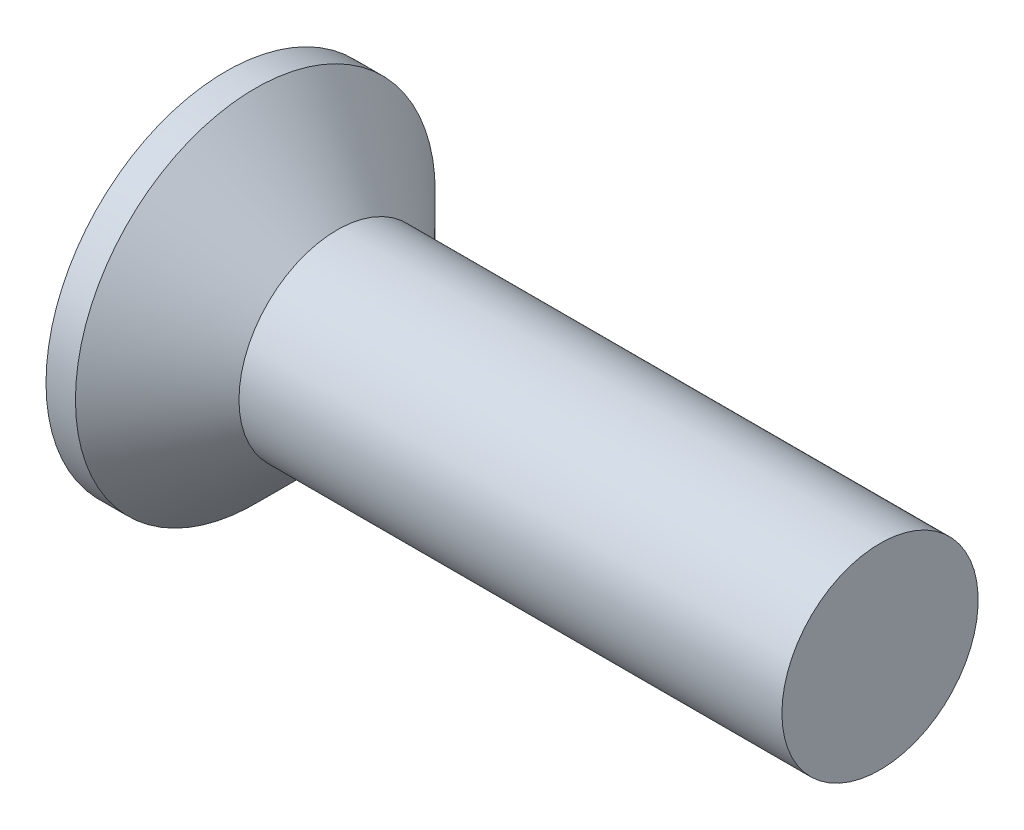
ISO-10303-21;
HEADER;
FILE_DESCRIPTION(('STEP AP214'),'2;1');
FILE_NAME('part.step','',(''),(''),'','','');
FILE_SCHEMA(('AUTOMOTIVE_DESIGN { 1 0 10303 214 1 1 1 1 }'));
ENDSEC;
DATA;
#1=APPLICATION_CONTEXT('core data for automotive mechanical design processes');
#2=APPLICATION_PROTOCOL_DEFINITION('international standard','automotive_design',2000,#1);
#3=PRODUCT_CONTEXT('',#1,'mechanical');
#4=PRODUCT('Part','Part','',(#3));
#5=PRODUCT_RELATED_PRODUCT_CATEGORY('part','',(#4));
#6=PRODUCT_DEFINITION_FORMATION('','',#4);
#7=PRODUCT_DEFINITION_CONTEXT('part definition',#1,'design');
#8=PRODUCT_DEFINITION('design','',#6,#7);
#9=PRODUCT_DEFINITION_SHAPE('','',#8);
#10=(LENGTH_UNIT() NAMED_UNIT(*) SI_UNIT(.MILLI.,.METRE.));
#11=(NAMED_UNIT(*) PLANE_ANGLE_UNIT() SI_UNIT($,.RADIAN.));
#12=(NAMED_UNIT(*) SI_UNIT($,.STERADIAN.) SOLID_ANGLE_UNIT());
#13=UNCERTAINTY_MEASURE_WITH_UNIT(LENGTH_MEASURE(1.E-05),#10,'distance_accuracy_value','');
#14=(GEOMETRIC_REPRESENTATION_CONTEXT(3) GLOBAL_UNCERTAINTY_ASSIGNED_CONTEXT((#13)) GLOBAL_UNIT_ASSIGNED_CONTEXT((#10,
#11,#12)) REPRESENTATION_CONTEXT('',''));
#15=CARTESIAN_POINT('',(0.,0.,0.));
#16=DIRECTION('',(0.,0.,1.));
#17=DIRECTION('',(1.,0.,0.));
#18=AXIS2_PLACEMENT_3D('',#15,#16,#17);
#19=CARTESIAN_POINT('',(0.,0.,0.));
#20=DIRECTION('',(-1.,0.,0.));
#21=DIRECTION('',(0.,0.,1.));
#22=AXIS2_PLACEMENT_3D('',#19,#20,#21);
#23=PLANE('',#22);
#24=CARTESIAN_POINT('',(0.,0.,0.));
#25=DIRECTION('',(-1.,0.,0.));
#26=DIRECTION('',(0.,0.,1.));
#27=AXIS2_PLACEMENT_3D('',#24,#25,#26);
#28=CIRCLE('',#27,2.75);
#29=CARTESIAN_POINT('',(0.,0.,2.75));
#30=VERTEX_POINT('',#29);
#31=EDGE_CURVE('E45',#30,#30,#28,.T.);
#32=ORIENTED_EDGE('',*,*,#31,.T.);
#33=EDGE_LOOP('',(#32));
#34=FACE_BOUND('',#33,.T.);
#35=DIRECTION('',(0.,1.,0.));
#36=VECTOR('',#35,1.);
#37=CARTESIAN_POINT('',(0.,-1.55,-0.395));
#38=LINE('',#37,#36);
#39=CARTESIAN_POINT('',(0.,-1.55,-0.395));
#40=VERTEX_POINT('',#39);
#41=CARTESIAN_POINT('',(0.,-0.394999999999999,-0.395));
#42=VERTEX_POINT('',#41);
#43=EDGE_CURVE('E106',#40,#42,#38,.T.);
#44=ORIENTED_EDGE('',*,*,#43,.T.);
#45=DIRECTION('',(0.,0.,-1.));
#46=VECTOR('',#45,1.);
#47=CARTESIAN_POINT('',(0.,-0.395000000000005,1.55));
#48=LINE('',#47,#46);
#49=CARTESIAN_POINT('',(0.,-0.394999999999995,-1.55));
#50=VERTEX_POINT('',#49);
#51=EDGE_CURVE('E86',#42,#50,#48,.T.);
#52=ORIENTED_EDGE('',*,*,#51,.T.);
#53=DIRECTION('',(0.,1.,0.));
#54=VECTOR('',#53,1.);
#55=CARTESIAN_POINT('',(0.,-0.394999999999995,-1.55));
#56=LINE('',#55,#54);
#57=CARTESIAN_POINT('',(0.,0.395000000000005,-1.55));
#58=VERTEX_POINT('',#57);
#59=EDGE_CURVE('E345',#50,#58,#56,.T.);
#60=ORIENTED_EDGE('',*,*,#59,.T.);
#61=DIRECTION('',(0.,0.,1.));
#62=VECTOR('',#61,1.);
#63=CARTESIAN_POINT('',(0.,0.395000000000005,-1.55));
#64=LINE('',#63,#62);
#65=CARTESIAN_POINT('',(0.,0.395000000000001,-0.395));
#66=VERTEX_POINT('',#65);
#67=EDGE_CURVE('E102',#58,#66,#64,.T.);
#68=ORIENTED_EDGE('',*,*,#67,.T.);
#69=CARTESIAN_POINT('',(0.,1.55,-0.395));
#70=VERTEX_POINT('',#69);
#71=EDGE_CURVE('E96',#66,#70,#38,.T.);
#72=ORIENTED_EDGE('',*,*,#71,.T.);
#73=DIRECTION('',(0.,0.,1.));
#74=VECTOR('',#73,1.);
#75=CARTESIAN_POINT('',(0.,1.55,-0.395));
#76=LINE('',#75,#74);
#77=CARTESIAN_POINT('',(0.,1.55,0.395));
#78=VERTEX_POINT('',#77);
#79=EDGE_CURVE('E99',#70,#78,#76,.T.);
#80=ORIENTED_EDGE('',*,*,#79,.T.);
#81=DIRECTION('',(0.,-1.,0.));
#82=VECTOR('',#81,1.);
#83=CARTESIAN_POINT('',(0.,1.55,0.395));
#84=LINE('',#83,#82);
#85=CARTESIAN_POINT('',(0.,0.394999999999998,0.395));
#86=VERTEX_POINT('',#85);
#87=EDGE_CURVE('E357',#78,#86,#84,.T.);
#88=ORIENTED_EDGE('',*,*,#87,.T.);
#89=CARTESIAN_POINT('',(0.,0.394999999999994,1.55));
#90=VERTEX_POINT('',#89);
#91=EDGE_CURVE('E340',#86,#90,#64,.T.);
#92=ORIENTED_EDGE('',*,*,#91,.T.);
#93=DIRECTION('',(0.,-1.,0.));
#94=VECTOR('',#93,1.);
#95=CARTESIAN_POINT('',(0.,0.394999999999994,1.55));
#96=LINE('',#95,#94);
#97=CARTESIAN_POINT('',(0.,-0.395000000000005,1.55));
#98=VERTEX_POINT('',#97);
#99=EDGE_CURVE('E326',#90,#98,#96,.T.);
#100=ORIENTED_EDGE('',*,*,#99,.T.);
#101=CARTESIAN_POINT('',(0.,-0.395000000000001,0.395));
#102=VERTEX_POINT('',#101);
#103=EDGE_CURVE('E338',#98,#102,#48,.T.);
#104=ORIENTED_EDGE('',*,*,#103,.T.);
#105=CARTESIAN_POINT('',(0.,-1.55,0.395));
#106=VERTEX_POINT('',#105);
#107=EDGE_CURVE('E112',#102,#106,#84,.T.);
#108=ORIENTED_EDGE('',*,*,#107,.T.);
#109=DIRECTION('',(0.,0.,-1.));
#110=VECTOR('',#109,1.);
#111=CARTESIAN_POINT('',(0.,-1.55,0.395));
#112=LINE('',#111,#110);
#113=EDGE_CURVE('E135',#106,#40,#112,.T.);
#114=ORIENTED_EDGE('',*,*,#113,.T.);
#115=EDGE_LOOP('',(#44,#52,#60,#68,#72,#80,#88,#92,#100,#104,#108,#114));
#116=FACE_BOUND('',#115,.T.);
#117=ADVANCED_FACE('F38',(#34,#116),#23,.T.);
#118=CARTESIAN_POINT('',(2.38373382624769,0.,0.16865988909427));
#119=DIRECTION('',(-0.0945267588569115,0.,-0.995522321125954));
#120=DIRECTION('',(-0.995522321125954,0.,0.0945267588569115));
#121=AXIS2_PLACEMENT_3D('',#118,#119,#120);
#122=PLANE('',#121);
#123=ORIENTED_EDGE('',*,*,#107,.F.);
#124=DIRECTION('',(0.991104257398676,0.0941072552097304,-0.0941072552097301));
#125=VECTOR('',#124,1.);
#126=CARTESIAN_POINT('',(2.39946475118715,-0.16716620751949,0.167166207519489));
#127=LINE('',#126,#125);
#128=CARTESIAN_POINT('',(2.08,-0.197500000000001,0.197499999999999));
#129=VERTEX_POINT('',#128);
#130=EDGE_CURVE('E130',#102,#129,#127,.T.);
#131=ORIENTED_EDGE('',*,*,#130,.T.);
#132=DIRECTION('',(0.835707904588477,0.543411029305728,-0.0793520726712617));
#133=VECTOR('',#132,1.);
#134=CARTESIAN_POINT('',(0.,-1.55,0.395));
#135=LINE('',#134,#133);
#136=EDGE_CURVE('E107',#106,#129,#135,.T.);
#137=ORIENTED_EDGE('',*,*,#136,.F.);
#138=EDGE_LOOP('',(#123,#131,#137));
#139=FACE_BOUND('',#138,.T.);
#140=ADVANCED_FACE('F158',(#139),#122,.T.);
#141=DIRECTION('',(0.835707904588477,-0.543411029305729,-0.0793520726712616));
#142=VECTOR('',#141,1.);
#143=CARTESIAN_POINT('',(0.,1.55,0.395));
#144=LINE('',#143,#142);
#145=CARTESIAN_POINT('',(2.08,0.1975,0.1975));
#146=VERTEX_POINT('',#145);
#147=EDGE_CURVE('E52',#78,#146,#144,.T.);
#148=ORIENTED_EDGE('',*,*,#147,.T.);
#149=DIRECTION('',(-0.991104257398676,0.0941072552097297,0.09410725520973));
#150=VECTOR('',#149,1.);
#151=CARTESIAN_POINT('',(2.39946475118715,0.167166207519489,0.167166207519489));
#152=LINE('',#151,#150);
#153=EDGE_CURVE('E353',#146,#86,#152,.T.);
#154=ORIENTED_EDGE('',*,*,#153,.T.);
#155=ORIENTED_EDGE('',*,*,#87,.F.);
#156=EDGE_LOOP('',(#148,#154,#155));
#157=FACE_BOUND('',#156,.T.);
#158=ADVANCED_FACE('F162',(#157),#122,.T.);
#159=CARTESIAN_POINT('',(2.38373382624769,0.,-0.16865988909427));
#160=DIRECTION('',(-0.0945267588569114,0.,0.995522321125954));
#161=DIRECTION('',(0.995522321125954,0.,0.0945267588569114));
#162=AXIS2_PLACEMENT_3D('',#159,#160,#161);
#163=PLANE('',#162);
#164=DIRECTION('',(0.835707904588477,0.543411029305729,0.0793520726712616));
#165=VECTOR('',#164,1.);
#166=CARTESIAN_POINT('',(0.,-1.55,-0.395));
#167=LINE('',#166,#165);
#168=CARTESIAN_POINT('',(2.08,-0.197499999999999,-0.197500000000001));
#169=VERTEX_POINT('',#168);
#170=EDGE_CURVE('E61',#40,#169,#167,.T.);
#171=ORIENTED_EDGE('',*,*,#170,.T.);
#172=DIRECTION('',(-0.991104257398676,-0.0941072552097297,-0.09410725520973));
#173=VECTOR('',#172,1.);
#174=CARTESIAN_POINT('',(2.39946475118715,-0.167166207519489,-0.167166207519489));
#175=LINE('',#174,#173);
#176=EDGE_CURVE('E11',#169,#42,#175,.T.);
#177=ORIENTED_EDGE('',*,*,#176,.T.);
#178=ORIENTED_EDGE('',*,*,#43,.F.);
#179=EDGE_LOOP('',(#171,#177,#178));
#180=FACE_BOUND('',#179,.T.);
#181=ADVANCED_FACE('F155',(#180),#163,.T.);
#182=ORIENTED_EDGE('',*,*,#71,.F.);
#183=DIRECTION('',(0.991104257398676,-0.0941072552097303,0.09410725520973));
#184=VECTOR('',#183,1.);
#185=CARTESIAN_POINT('',(2.39946475118715,0.16716620751949,-0.167166207519489));
#186=LINE('',#185,#184);
#187=CARTESIAN_POINT('',(2.08,0.1975,-0.1975));
#188=VERTEX_POINT('',#187);
#189=EDGE_CURVE('E115',#66,#188,#186,.T.);
#190=ORIENTED_EDGE('',*,*,#189,.T.);
#191=DIRECTION('',(0.835707904588477,-0.543411029305729,0.0793520726712616));
#192=VECTOR('',#191,1.);
#193=CARTESIAN_POINT('',(0.,1.55,-0.395));
#194=LINE('',#193,#192);
#195=EDGE_CURVE('E111',#70,#188,#194,.T.);
#196=ORIENTED_EDGE('',*,*,#195,.F.);
#197=EDGE_LOOP('',(#182,#190,#196));
#198=FACE_BOUND('',#197,.T.);
#199=ADVANCED_FACE('F114',(#198),#163,.T.);
#200=CARTESIAN_POINT('',(-6.34999999999999,0.,0.));
#201=DIRECTION('',(-1.,0.,0.));
#202=DIRECTION('',(0.,0.,1.));
#203=AXIS2_PLACEMENT_3D('',#200,#201,#202);
#204=CYLINDRICAL_SURFACE('',#203,2.75);
#205=CARTESIAN_POINT('',(0.450000000000005,0.,0.));
#206=DIRECTION('',(-1.,0.,0.));
#207=DIRECTION('',(0.,0.,1.));
#208=AXIS2_PLACEMENT_3D('',#205,#206,#207);
#209=CIRCLE('',#208,2.75);
#210=CARTESIAN_POINT('',(0.450000000000005,0.,2.75));
#211=VERTEX_POINT('',#210);
#212=EDGE_CURVE('E138',#211,#211,#209,.T.);
#213=ORIENTED_EDGE('',*,*,#212,.T.);
#214=EDGE_LOOP('',(#213));
#215=FACE_BOUND('',#214,.T.);
#216=ORIENTED_EDGE('',*,*,#31,.F.);
#217=EDGE_LOOP('',(#216));
#218=FACE_BOUND('',#217,.T.);
#219=ADVANCED_FACE('F144',(#215,#218),#204,.T.);
#220=CARTESIAN_POINT('',(0.450000000000005,0.,0.));
#221=DIRECTION('',(-1.,0.,0.));
#222=DIRECTION('',(0.,0.,1.));
#223=AXIS2_PLACEMENT_3D('',#220,#221,#222);
#224=CONICAL_SURFACE('',#223,2.75,0.78539816339745);
#225=CARTESIAN_POINT('',(1.7,0.,0.));
#226=DIRECTION('',(-1.,0.,0.));
#227=DIRECTION('',(0.,0.,1.));
#228=AXIS2_PLACEMENT_3D('',#225,#226,#227);
#229=CIRCLE('',#228,1.5);
#230=CARTESIAN_POINT('',(1.7,0.,1.5));
#231=VERTEX_POINT('',#230);
#232=EDGE_CURVE('E134',#231,#231,#229,.T.);
#233=ORIENTED_EDGE('',*,*,#232,.T.);
#234=EDGE_LOOP('',(#233));
#235=FACE_BOUND('',#234,.T.);
#236=ORIENTED_EDGE('',*,*,#212,.F.);
#237=EDGE_LOOP('',(#236));
#238=FACE_BOUND('',#237,.T.);
#239=ADVANCED_FACE('F146',(#235,#238),#224,.T.);
#240=CARTESIAN_POINT('',(-6.34999999999999,0.,0.));
#241=DIRECTION('',(-1.,0.,0.));
#242=DIRECTION('',(0.,0.,1.));
#243=AXIS2_PLACEMENT_3D('',#240,#241,#242);
#244=CYLINDRICAL_SURFACE('',#243,1.5);
#245=CARTESIAN_POINT('',(10.,0.,0.));
#246=DIRECTION('',(-1.,0.,0.));
#247=DIRECTION('',(0.,0.,1.));
#248=AXIS2_PLACEMENT_3D('',#245,#246,#247);
#249=CIRCLE('',#248,1.5);
#250=CARTESIAN_POINT('',(10.,0.,1.5));
#251=VERTEX_POINT('',#250);
#252=EDGE_CURVE('E131',#251,#251,#249,.T.);
#253=ORIENTED_EDGE('',*,*,#252,.T.);
#254=EDGE_LOOP('',(#253));
#255=FACE_BOUND('',#254,.T.);
#256=ORIENTED_EDGE('',*,*,#232,.F.);
#257=EDGE_LOOP('',(#256));
#258=FACE_BOUND('',#257,.T.);
#259=ADVANCED_FACE('F152',(#255,#258),#244,.T.);
#260=CARTESIAN_POINT('',(10.,1.5,0.));
#261=DIRECTION('',(1.,0.,0.));
#262=DIRECTION('',(0.,0.,-1.));
#263=AXIS2_PLACEMENT_3D('',#260,#261,#262);
#264=PLANE('',#263);
#265=ORIENTED_EDGE('',*,*,#252,.F.);
#266=EDGE_LOOP('',(#265));
#267=FACE_BOUND('',#266,.T.);
#268=ADVANCED_FACE('F182',(#267),#264,.T.);
#269=CARTESIAN_POINT('',(2.08,0.1975,-0.1975));
#270=DIRECTION('',(1.,0.,0.));
#271=DIRECTION('',(0.,0.,-1.));
#272=AXIS2_PLACEMENT_3D('',#269,#270,#271);
#273=PLANE('',#272);
#274=DIRECTION('',(0.,1.,0.));
#275=VECTOR('',#274,1.);
#276=CARTESIAN_POINT('',(2.08,-0.1975,-0.1975));
#277=LINE('',#276,#275);
#278=EDGE_CURVE('E126',#169,#188,#277,.T.);
#279=ORIENTED_EDGE('',*,*,#278,.F.);
#280=DIRECTION('',(0.,0.,-1.));
#281=VECTOR('',#280,1.);
#282=CARTESIAN_POINT('',(2.08,-0.1975,0.1975));
#283=LINE('',#282,#281);
#284=EDGE_CURVE('E117',#129,#169,#283,.T.);
#285=ORIENTED_EDGE('',*,*,#284,.F.);
#286=DIRECTION('',(0.,-1.,0.));
#287=VECTOR('',#286,1.);
#288=CARTESIAN_POINT('',(2.08,0.1975,0.1975));
#289=LINE('',#288,#287);
#290=EDGE_CURVE('E120',#146,#129,#289,.T.);
#291=ORIENTED_EDGE('',*,*,#290,.F.);
#292=DIRECTION('',(0.,0.,1.));
#293=VECTOR('',#292,1.);
#294=CARTESIAN_POINT('',(2.08,0.1975,-0.1975));
#295=LINE('',#294,#293);
#296=EDGE_CURVE('E124',#188,#146,#295,.T.);
#297=ORIENTED_EDGE('',*,*,#296,.F.);
#298=EDGE_LOOP('',(#279,#285,#291,#297));
#299=FACE_BOUND('',#298,.T.);
#300=ADVANCED_FACE('F179',(#299),#273,.F.);
#301=CARTESIAN_POINT('',(0.,-1.55,-0.395));
#302=DIRECTION('',(-0.54513001368185,0.838351518268576,0.));
#303=DIRECTION('',(-0.838351518268576,-0.54513001368185,0.));
#304=AXIS2_PLACEMENT_3D('',#301,#302,#303);
#305=PLANE('',#304);
#306=ORIENTED_EDGE('',*,*,#170,.F.);
#307=ORIENTED_EDGE('',*,*,#113,.F.);
#308=ORIENTED_EDGE('',*,*,#136,.T.);
#309=ORIENTED_EDGE('',*,*,#284,.T.);
#310=EDGE_LOOP('',(#306,#307,#308,#309));
#311=FACE_BOUND('',#310,.T.);
#312=ADVANCED_FACE('F171',(#311),#305,.T.);
#313=CARTESIAN_POINT('',(0.,1.55,0.395));
#314=DIRECTION('',(-0.54513001368185,-0.838351518268576,0.));
#315=DIRECTION('',(0.838351518268576,-0.54513001368185,0.));
#316=AXIS2_PLACEMENT_3D('',#313,#314,#315);
#317=PLANE('',#316);
#318=ORIENTED_EDGE('',*,*,#147,.F.);
#319=ORIENTED_EDGE('',*,*,#79,.F.);
#320=ORIENTED_EDGE('',*,*,#195,.T.);
#321=ORIENTED_EDGE('',*,*,#296,.T.);
#322=EDGE_LOOP('',(#318,#319,#320,#321));
#323=FACE_BOUND('',#322,.T.);
#324=ADVANCED_FACE('F110',(#323),#317,.T.);
#325=CARTESIAN_POINT('',(2.38373382624769,-0.16865988909427,0.));
#326=DIRECTION('',(-0.0945267588569115,0.995522321125954,0.));
#327=DIRECTION('',(-0.995522321125954,-0.0945267588569115,0.));
#328=AXIS2_PLACEMENT_3D('',#325,#326,#327);
#329=PLANE('',#328);
#330=DIRECTION('',(0.835707904588477,0.0793520726712598,0.543411029305729));
#331=VECTOR('',#330,1.);
#332=CARTESIAN_POINT('',(0.,-0.394999999999995,-1.55));
#333=LINE('',#332,#331);
#334=EDGE_CURVE('E347',#50,#169,#333,.T.);
#335=ORIENTED_EDGE('',*,*,#334,.F.);
#336=ORIENTED_EDGE('',*,*,#51,.F.);
#337=ORIENTED_EDGE('',*,*,#176,.F.);
#338=EDGE_LOOP('',(#335,#336,#337));
#339=FACE_BOUND('',#338,.T.);
#340=ADVANCED_FACE('F178',(#339),#329,.T.);
#341=CARTESIAN_POINT('',(2.38373382624769,0.16865988909427,0.));
#342=DIRECTION('',(-0.0945267588569114,-0.995522321125954,0.));
#343=DIRECTION('',(0.995522321125954,-0.0945267588569114,0.));
#344=AXIS2_PLACEMENT_3D('',#341,#342,#343);
#345=PLANE('',#344);
#346=ORIENTED_EDGE('',*,*,#67,.F.);
#347=DIRECTION('',(0.835707904588477,-0.0793520726712635,0.543411029305728));
#348=VECTOR('',#347,1.);
#349=CARTESIAN_POINT('',(0.,0.395000000000005,-1.55));
#350=LINE('',#349,#348);
#351=EDGE_CURVE('E77',#58,#188,#350,.T.);
#352=ORIENTED_EDGE('',*,*,#351,.T.);
#353=ORIENTED_EDGE('',*,*,#189,.F.);
#354=EDGE_LOOP('',(#346,#352,#353));
#355=FACE_BOUND('',#354,.T.);
#356=ADVANCED_FACE('F223',(#355),#345,.T.);
#357=CARTESIAN_POINT('',(0.,0.395000000000005,-1.55));
#358=DIRECTION('',(-0.54513001368185,0.,0.838351518268576));
#359=DIRECTION('',(-0.838351518268576,0.,-0.54513001368185));
#360=AXIS2_PLACEMENT_3D('',#357,#358,#359);
#361=PLANE('',#360);
#362=ORIENTED_EDGE('',*,*,#351,.F.);
#363=ORIENTED_EDGE('',*,*,#59,.F.);
#364=ORIENTED_EDGE('',*,*,#334,.T.);
#365=ORIENTED_EDGE('',*,*,#278,.T.);
#366=EDGE_LOOP('',(#362,#363,#364,#365));
#367=FACE_BOUND('',#366,.T.);
#368=ADVANCED_FACE('F231',(#367),#361,.T.);
#369=ORIENTED_EDGE('',*,*,#103,.F.);
#370=DIRECTION('',(0.835707904588477,0.0793520726712635,-0.543411029305728));
#371=VECTOR('',#370,1.);
#372=CARTESIAN_POINT('',(0.,-0.395000000000005,1.55));
#373=LINE('',#372,#371);
#374=EDGE_CURVE('E323',#98,#129,#373,.T.);
#375=ORIENTED_EDGE('',*,*,#374,.T.);
#376=ORIENTED_EDGE('',*,*,#130,.F.);
#377=EDGE_LOOP('',(#369,#375,#376));
#378=FACE_BOUND('',#377,.T.);
#379=ADVANCED_FACE('F225',(#378),#329,.T.);
#380=DIRECTION('',(0.835707904588477,-0.0793520726712597,-0.543411029305729));
#381=VECTOR('',#380,1.);
#382=CARTESIAN_POINT('',(0.,0.394999999999994,1.55));
#383=LINE('',#382,#381);
#384=EDGE_CURVE('E334',#90,#146,#383,.T.);
#385=ORIENTED_EDGE('',*,*,#384,.F.);
#386=ORIENTED_EDGE('',*,*,#91,.F.);
#387=ORIENTED_EDGE('',*,*,#153,.F.);
#388=EDGE_LOOP('',(#385,#386,#387));
#389=FACE_BOUND('',#388,.T.);
#390=ADVANCED_FACE('F233',(#389),#345,.T.);
#391=CARTESIAN_POINT('',(0.,-0.395000000000005,1.55));
#392=DIRECTION('',(-0.54513001368185,0.,-0.838351518268576));
#393=DIRECTION('',(0.838351518268576,0.,-0.54513001368185));
#394=AXIS2_PLACEMENT_3D('',#391,#392,#393);
#395=PLANE('',#394);
#396=ORIENTED_EDGE('',*,*,#374,.F.);
#397=ORIENTED_EDGE('',*,*,#99,.F.);
#398=ORIENTED_EDGE('',*,*,#384,.T.);
#399=ORIENTED_EDGE('',*,*,#290,.T.);
#400=EDGE_LOOP('',(#396,#397,#398,#399));
#401=FACE_BOUND('',#400,.T.);
#402=ADVANCED_FACE('F252',(#401),#395,.T.);
#403=CLOSED_SHELL('',(#117,#140,#158,#181,#199,#219,#239,#259,#268,#300,#312,#324,#340,#356,
#368,#379,#390,#402));
#404=MANIFOLD_SOLID_BREP('B2',#403);
#405=ADVANCED_BREP_SHAPE_REPRESENTATION('',(#18,#404),#14);
#406=SHAPE_DEFINITION_REPRESENTATION(#9,#405);
ENDSEC;
END-ISO-10303-21;
